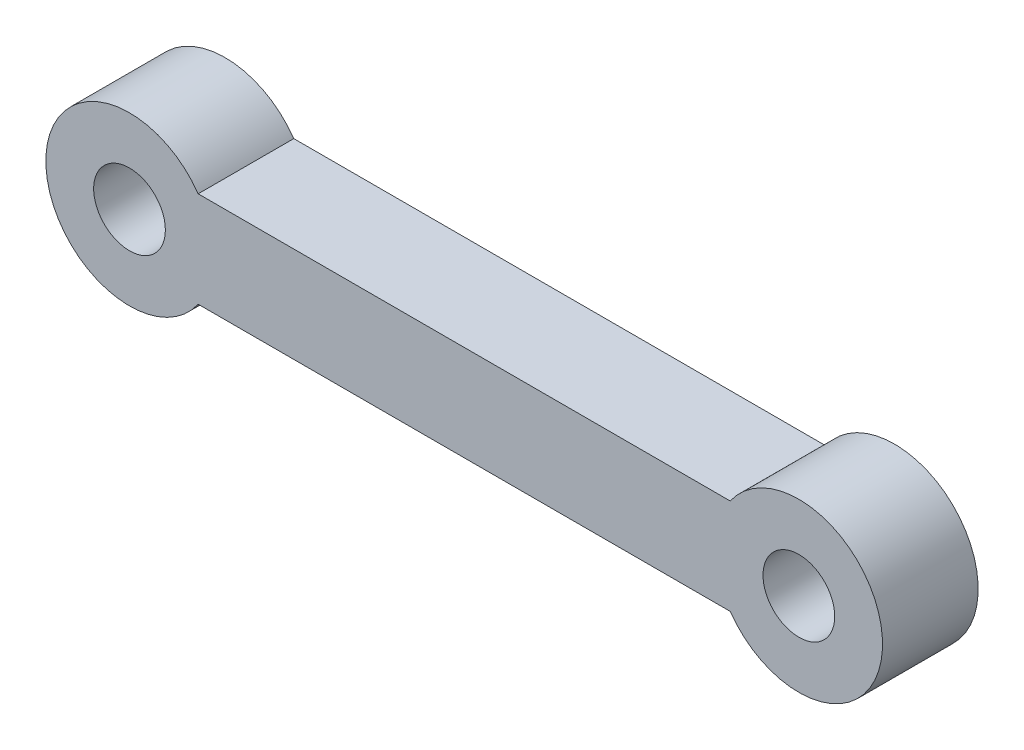
ISO-10303-21;
HEADER;
FILE_DESCRIPTION(('STEP AP214'),'2;1');
FILE_NAME('part.step','',(''),(''),'','','');
FILE_SCHEMA(('AUTOMOTIVE_DESIGN { 1 0 10303 214 1 1 1 1 }'));
ENDSEC;
DATA;
#1=APPLICATION_CONTEXT('core data for automotive mechanical design processes');
#2=APPLICATION_PROTOCOL_DEFINITION('international standard','automotive_design',2000,#1);
#3=PRODUCT_CONTEXT('',#1,'mechanical');
#4=PRODUCT('Part','Part','',(#3));
#5=PRODUCT_RELATED_PRODUCT_CATEGORY('part','',(#4));
#6=PRODUCT_DEFINITION_FORMATION('','',#4);
#7=PRODUCT_DEFINITION_CONTEXT('part definition',#1,'design');
#8=PRODUCT_DEFINITION('design','',#6,#7);
#9=PRODUCT_DEFINITION_SHAPE('','',#8);
#10=(LENGTH_UNIT() NAMED_UNIT(*) SI_UNIT(.MILLI.,.METRE.));
#11=(NAMED_UNIT(*) PLANE_ANGLE_UNIT() SI_UNIT($,.RADIAN.));
#12=(NAMED_UNIT(*) SI_UNIT($,.STERADIAN.) SOLID_ANGLE_UNIT());
#13=UNCERTAINTY_MEASURE_WITH_UNIT(LENGTH_MEASURE(1.E-05),#10,'distance_accuracy_value','');
#14=(GEOMETRIC_REPRESENTATION_CONTEXT(3) GLOBAL_UNCERTAINTY_ASSIGNED_CONTEXT((#13)) GLOBAL_UNIT_ASSIGNED_CONTEXT((#10,
#11,#12)) REPRESENTATION_CONTEXT('',''));
#15=CARTESIAN_POINT('',(0.,0.,0.));
#16=DIRECTION('',(0.,0.,1.));
#17=DIRECTION('',(1.,0.,0.));
#18=AXIS2_PLACEMENT_3D('',#15,#16,#17);
#19=CARTESIAN_POINT('',(-10.,10.,20.));
#20=DIRECTION('',(0.,0.,-1.));
#21=DIRECTION('',(-1.,0.,0.));
#22=AXIS2_PLACEMENT_3D('',#19,#20,#21);
#23=CYLINDRICAL_SURFACE('',#22,17.5);
#24=CARTESIAN_POINT('',(-10.,10.,0.));
#25=DIRECTION('',(0.,0.,1.));
#26=DIRECTION('',(1.,0.,0.));
#27=AXIS2_PLACEMENT_3D('',#24,#25,#26);
#28=CIRCLE('',#27,17.5);
#29=CARTESIAN_POINT('',(4.36140661634508,20.,0.));
#30=VERTEX_POINT('',#29);
#31=CARTESIAN_POINT('',(4.36140661634508,0.,0.));
#32=VERTEX_POINT('',#31);
#33=EDGE_CURVE('E113',#30,#32,#28,.T.);
#34=ORIENTED_EDGE('',*,*,#33,.T.);
#35=DIRECTION('',(0.,0.,-1.));
#36=VECTOR('',#35,1.);
#37=CARTESIAN_POINT('',(4.36140661634508,0.,20.));
#38=LINE('',#37,#36);
#39=CARTESIAN_POINT('',(4.36140661634508,0.,20.));
#40=VERTEX_POINT('',#39);
#41=EDGE_CURVE('E11',#40,#32,#38,.T.);
#42=ORIENTED_EDGE('',*,*,#41,.F.);
#43=CARTESIAN_POINT('',(-10.,10.,20.));
#44=DIRECTION('',(0.,0.,1.));
#45=DIRECTION('',(1.,0.,0.));
#46=AXIS2_PLACEMENT_3D('',#43,#44,#45);
#47=CIRCLE('',#46,17.5);
#48=CARTESIAN_POINT('',(4.36140661634508,20.,20.));
#49=VERTEX_POINT('',#48);
#50=EDGE_CURVE('E93',#49,#40,#47,.T.);
#51=ORIENTED_EDGE('',*,*,#50,.F.);
#52=DIRECTION('',(0.,0.,-1.));
#53=VECTOR('',#52,1.);
#54=CARTESIAN_POINT('',(4.36140661634508,20.,20.));
#55=LINE('',#54,#53);
#56=EDGE_CURVE('E59',#49,#30,#55,.T.);
#57=ORIENTED_EDGE('',*,*,#56,.T.);
#58=EDGE_LOOP('',(#34,#42,#51,#57));
#59=FACE_BOUND('',#58,.T.);
#60=ADVANCED_FACE('F43',(#59),#23,.T.);
#61=CARTESIAN_POINT('',(0.,0.,20.));
#62=DIRECTION('',(0.,1.,0.));
#63=DIRECTION('',(0.,0.,1.));
#64=AXIS2_PLACEMENT_3D('',#61,#62,#63);
#65=PLANE('',#64);
#66=DIRECTION('',(1.,0.,0.));
#67=VECTOR('',#66,1.);
#68=CARTESIAN_POINT('',(0.,0.,0.));
#69=LINE('',#68,#67);
#70=CARTESIAN_POINT('',(115.638593383655,0.,0.));
#71=VERTEX_POINT('',#70);
#72=EDGE_CURVE('E98',#32,#71,#69,.T.);
#73=ORIENTED_EDGE('',*,*,#72,.T.);
#74=DIRECTION('',(0.,0.,-1.));
#75=VECTOR('',#74,1.);
#76=CARTESIAN_POINT('',(115.638593383655,0.,20.));
#77=LINE('',#76,#75);
#78=CARTESIAN_POINT('',(115.638593383655,0.,20.));
#79=VERTEX_POINT('',#78);
#80=EDGE_CURVE('E51',#79,#71,#77,.T.);
#81=ORIENTED_EDGE('',*,*,#80,.F.);
#82=DIRECTION('',(1.,0.,0.));
#83=VECTOR('',#82,1.);
#84=CARTESIAN_POINT('',(0.,0.,20.));
#85=LINE('',#84,#83);
#86=EDGE_CURVE('E85',#40,#79,#85,.T.);
#87=ORIENTED_EDGE('',*,*,#86,.F.);
#88=ORIENTED_EDGE('',*,*,#41,.T.);
#89=EDGE_LOOP('',(#73,#81,#87,#88));
#90=FACE_BOUND('',#89,.T.);
#91=ADVANCED_FACE('F97',(#90),#65,.F.);
#92=CARTESIAN_POINT('',(130.,10.,20.));
#93=DIRECTION('',(0.,0.,-1.));
#94=DIRECTION('',(-1.,0.,0.));
#95=AXIS2_PLACEMENT_3D('',#92,#93,#94);
#96=CYLINDRICAL_SURFACE('',#95,17.5);
#97=CARTESIAN_POINT('',(130.,10.,0.));
#98=DIRECTION('',(0.,0.,1.));
#99=DIRECTION('',(1.,0.,0.));
#100=AXIS2_PLACEMENT_3D('',#97,#98,#99);
#101=CIRCLE('',#100,17.5);
#102=CARTESIAN_POINT('',(115.638593383655,20.,0.));
#103=VERTEX_POINT('',#102);
#104=EDGE_CURVE('E116',#71,#103,#101,.T.);
#105=ORIENTED_EDGE('',*,*,#104,.T.);
#106=DIRECTION('',(0.,0.,-1.));
#107=VECTOR('',#106,1.);
#108=CARTESIAN_POINT('',(115.638593383655,20.,20.));
#109=LINE('',#108,#107);
#110=CARTESIAN_POINT('',(115.638593383655,20.,20.));
#111=VERTEX_POINT('',#110);
#112=EDGE_CURVE('E74',#111,#103,#109,.T.);
#113=ORIENTED_EDGE('',*,*,#112,.F.);
#114=CARTESIAN_POINT('',(130.,10.,20.));
#115=DIRECTION('',(0.,0.,1.));
#116=DIRECTION('',(1.,0.,0.));
#117=AXIS2_PLACEMENT_3D('',#114,#115,#116);
#118=CIRCLE('',#117,17.5);
#119=EDGE_CURVE('E92',#79,#111,#118,.T.);
#120=ORIENTED_EDGE('',*,*,#119,.F.);
#121=ORIENTED_EDGE('',*,*,#80,.T.);
#122=EDGE_LOOP('',(#105,#113,#120,#121));
#123=FACE_BOUND('',#122,.T.);
#124=ADVANCED_FACE('F101',(#123),#96,.T.);
#125=CARTESIAN_POINT('',(130.,10.,20.));
#126=DIRECTION('',(0.,0.,-1.));
#127=DIRECTION('',(-1.,0.,0.));
#128=AXIS2_PLACEMENT_3D('',#125,#126,#127);
#129=CYLINDRICAL_SURFACE('',#128,7.50000000000001);
#130=CARTESIAN_POINT('',(130.,10.,20.));
#131=DIRECTION('',(0.,0.,1.));
#132=DIRECTION('',(1.,0.,0.));
#133=AXIS2_PLACEMENT_3D('',#130,#131,#132);
#134=CIRCLE('',#133,7.50000000000001);
#135=CARTESIAN_POINT('',(137.5,10.,20.));
#136=VERTEX_POINT('',#135);
#137=EDGE_CURVE('E104',#136,#136,#134,.T.);
#138=ORIENTED_EDGE('',*,*,#137,.T.);
#139=EDGE_LOOP('',(#138));
#140=FACE_BOUND('',#139,.T.);
#141=CARTESIAN_POINT('',(130.,10.,0.));
#142=DIRECTION('',(0.,0.,1.));
#143=DIRECTION('',(1.,0.,0.));
#144=AXIS2_PLACEMENT_3D('',#141,#142,#143);
#145=CIRCLE('',#144,7.50000000000001);
#146=CARTESIAN_POINT('',(137.5,10.,0.));
#147=VERTEX_POINT('',#146);
#148=EDGE_CURVE('E121',#147,#147,#145,.T.);
#149=ORIENTED_EDGE('',*,*,#148,.F.);
#150=EDGE_LOOP('',(#149));
#151=FACE_BOUND('',#150,.T.);
#152=ADVANCED_FACE('F142',(#140,#151),#129,.F.);
#153=CARTESIAN_POINT('',(0.,20.,20.));
#154=DIRECTION('',(0.,1.,0.));
#155=DIRECTION('',(0.,0.,1.));
#156=AXIS2_PLACEMENT_3D('',#153,#154,#155);
#157=PLANE('',#156);
#158=DIRECTION('',(1.,0.,0.));
#159=VECTOR('',#158,1.);
#160=CARTESIAN_POINT('',(0.,20.,0.));
#161=LINE('',#160,#159);
#162=EDGE_CURVE('E118',#30,#103,#161,.T.);
#163=ORIENTED_EDGE('',*,*,#162,.F.);
#164=ORIENTED_EDGE('',*,*,#56,.F.);
#165=DIRECTION('',(1.,0.,0.));
#166=VECTOR('',#165,1.);
#167=CARTESIAN_POINT('',(0.,20.,20.));
#168=LINE('',#167,#166);
#169=EDGE_CURVE('E102',#49,#111,#168,.T.);
#170=ORIENTED_EDGE('',*,*,#169,.T.);
#171=ORIENTED_EDGE('',*,*,#112,.T.);
#172=EDGE_LOOP('',(#163,#164,#170,#171));
#173=FACE_BOUND('',#172,.T.);
#174=ADVANCED_FACE('F134',(#173),#157,.T.);
#175=CARTESIAN_POINT('',(-10.,10.,20.));
#176=DIRECTION('',(0.,0.,-1.));
#177=DIRECTION('',(-1.,0.,0.));
#178=AXIS2_PLACEMENT_3D('',#175,#176,#177);
#179=CYLINDRICAL_SURFACE('',#178,7.5);
#180=CARTESIAN_POINT('',(-10.,10.,20.));
#181=DIRECTION('',(0.,0.,1.));
#182=DIRECTION('',(1.,0.,0.));
#183=AXIS2_PLACEMENT_3D('',#180,#181,#182);
#184=CIRCLE('',#183,7.5);
#185=CARTESIAN_POINT('',(-2.5,10.,20.));
#186=VERTEX_POINT('',#185);
#187=EDGE_CURVE('E110',#186,#186,#184,.T.);
#188=ORIENTED_EDGE('',*,*,#187,.T.);
#189=EDGE_LOOP('',(#188));
#190=FACE_BOUND('',#189,.T.);
#191=CARTESIAN_POINT('',(-10.,10.,0.));
#192=DIRECTION('',(0.,0.,1.));
#193=DIRECTION('',(1.,0.,0.));
#194=AXIS2_PLACEMENT_3D('',#191,#192,#193);
#195=CIRCLE('',#194,7.5);
#196=CARTESIAN_POINT('',(-2.5,10.,0.));
#197=VERTEX_POINT('',#196);
#198=EDGE_CURVE('E124',#197,#197,#195,.T.);
#199=ORIENTED_EDGE('',*,*,#198,.F.);
#200=EDGE_LOOP('',(#199));
#201=FACE_BOUND('',#200,.T.);
#202=ADVANCED_FACE('F132',(#190,#201),#179,.F.);
#203=CARTESIAN_POINT('',(0.,0.,20.));
#204=DIRECTION('',(0.,0.,1.));
#205=DIRECTION('',(1.,0.,0.));
#206=AXIS2_PLACEMENT_3D('',#203,#204,#205);
#207=PLANE('',#206);
#208=ORIENTED_EDGE('',*,*,#50,.T.);
#209=ORIENTED_EDGE('',*,*,#86,.T.);
#210=ORIENTED_EDGE('',*,*,#119,.T.);
#211=ORIENTED_EDGE('',*,*,#169,.F.);
#212=EDGE_LOOP('',(#208,#209,#210,#211));
#213=FACE_BOUND('',#212,.T.);
#214=ORIENTED_EDGE('',*,*,#137,.F.);
#215=EDGE_LOOP('',(#214));
#216=FACE_BOUND('',#215,.T.);
#217=ORIENTED_EDGE('',*,*,#187,.F.);
#218=EDGE_LOOP('',(#217));
#219=FACE_BOUND('',#218,.T.);
#220=ADVANCED_FACE('F88',(#213,#216,#219),#207,.T.);
#221=CARTESIAN_POINT('',(0.,0.,0.));
#222=DIRECTION('',(0.,0.,1.));
#223=DIRECTION('',(1.,0.,0.));
#224=AXIS2_PLACEMENT_3D('',#221,#222,#223);
#225=PLANE('',#224);
#226=ORIENTED_EDGE('',*,*,#33,.F.);
#227=ORIENTED_EDGE('',*,*,#162,.T.);
#228=ORIENTED_EDGE('',*,*,#104,.F.);
#229=ORIENTED_EDGE('',*,*,#72,.F.);
#230=EDGE_LOOP('',(#226,#227,#228,#229));
#231=FACE_BOUND('',#230,.T.);
#232=ORIENTED_EDGE('',*,*,#148,.T.);
#233=EDGE_LOOP('',(#232));
#234=FACE_BOUND('',#233,.T.);
#235=ORIENTED_EDGE('',*,*,#198,.T.);
#236=EDGE_LOOP('',(#235));
#237=FACE_BOUND('',#236,.T.);
#238=ADVANCED_FACE('F130',(#231,#234,#237),#225,.F.);
#239=CLOSED_SHELL('',(#60,#91,#124,#152,#174,#202,#220,#238));
#240=MANIFOLD_SOLID_BREP('B2',#239);
#241=ADVANCED_BREP_SHAPE_REPRESENTATION('',(#18,#240),#14);
#242=SHAPE_DEFINITION_REPRESENTATION(#9,#241);
ENDSEC;
END-ISO-10303-21;
